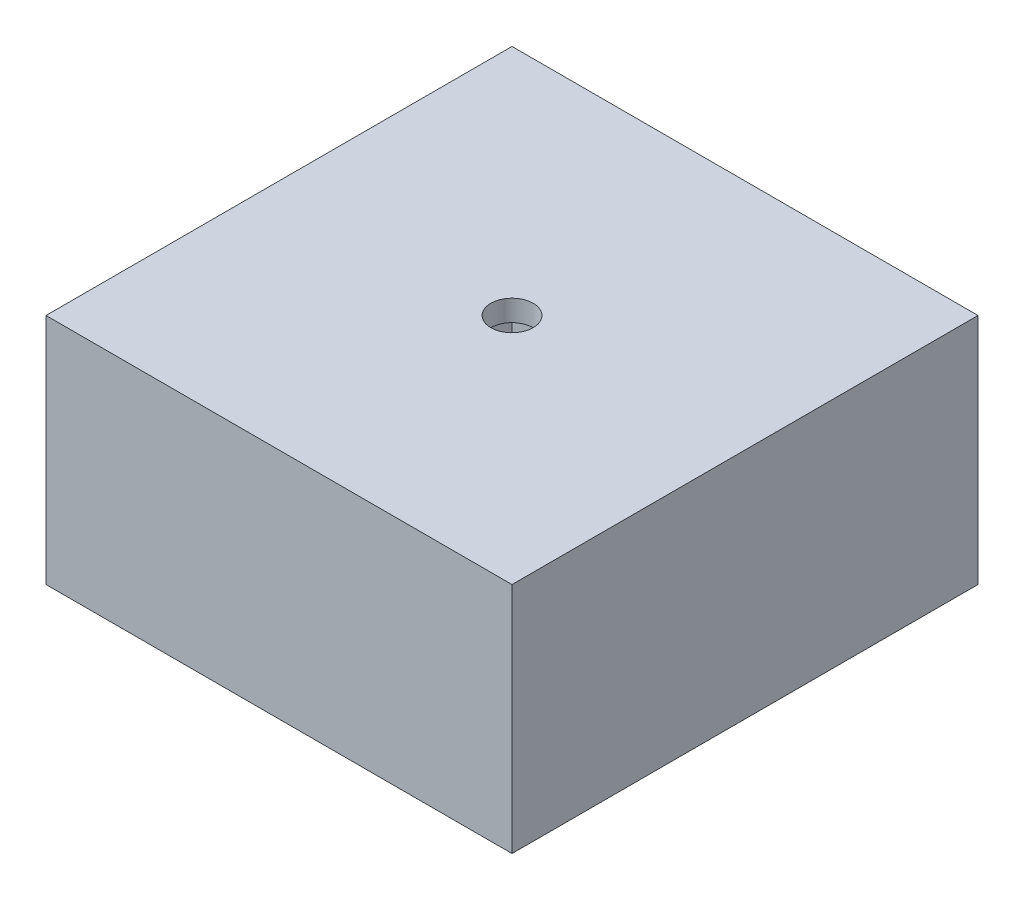
ISO-10303-21;
HEADER;
FILE_DESCRIPTION(('STEP AP214'),'2;1');
FILE_NAME('part.step','',(''),(''),'','','');
FILE_SCHEMA(('AUTOMOTIVE_DESIGN { 1 0 10303 214 1 1 1 1 }'));
ENDSEC;
DATA;
#1=APPLICATION_CONTEXT('core data for automotive mechanical design processes');
#2=APPLICATION_PROTOCOL_DEFINITION('international standard','automotive_design',2000,#1);
#3=PRODUCT_CONTEXT('',#1,'mechanical');
#4=PRODUCT('Part','Part','',(#3));
#5=PRODUCT_RELATED_PRODUCT_CATEGORY('part','',(#4));
#6=PRODUCT_DEFINITION_FORMATION('','',#4);
#7=PRODUCT_DEFINITION_CONTEXT('part definition',#1,'design');
#8=PRODUCT_DEFINITION('design','',#6,#7);
#9=PRODUCT_DEFINITION_SHAPE('','',#8);
#10=(LENGTH_UNIT() NAMED_UNIT(*) SI_UNIT(.MILLI.,.METRE.));
#11=(NAMED_UNIT(*) PLANE_ANGLE_UNIT() SI_UNIT($,.RADIAN.));
#12=(NAMED_UNIT(*) SI_UNIT($,.STERADIAN.) SOLID_ANGLE_UNIT());
#13=UNCERTAINTY_MEASURE_WITH_UNIT(LENGTH_MEASURE(1.E-05),#10,'distance_accuracy_value','');
#14=(GEOMETRIC_REPRESENTATION_CONTEXT(3) GLOBAL_UNCERTAINTY_ASSIGNED_CONTEXT((#13)) GLOBAL_UNIT_ASSIGNED_CONTEXT((#10,
#11,#12)) REPRESENTATION_CONTEXT('',''));
#15=CARTESIAN_POINT('',(0.,0.,0.));
#16=DIRECTION('',(0.,0.,1.));
#17=DIRECTION('',(1.,0.,0.));
#18=AXIS2_PLACEMENT_3D('',#15,#16,#17);
#19=CARTESIAN_POINT('',(0.,0.,0.));
#20=DIRECTION('',(0.,1.,0.));
#21=DIRECTION('',(0.,0.,1.));
#22=AXIS2_PLACEMENT_3D('',#19,#20,#21);
#23=PLANE('',#22);
#24=DIRECTION('',(0.,0.,-1.));
#25=VECTOR('',#24,1.);
#26=CARTESIAN_POINT('',(22.,0.,0.));
#27=LINE('',#26,#25);
#28=CARTESIAN_POINT('',(22.,0.,22.));
#29=VERTEX_POINT('',#28);
#30=CARTESIAN_POINT('',(22.,0.,-22.));
#31=VERTEX_POINT('',#30);
#32=EDGE_CURVE('E188',#29,#31,#27,.T.);
#33=ORIENTED_EDGE('',*,*,#32,.F.);
#34=DIRECTION('',(1.,0.,0.));
#35=VECTOR('',#34,1.);
#36=CARTESIAN_POINT('',(0.,0.,22.));
#37=LINE('',#36,#35);
#38=CARTESIAN_POINT('',(-22.,0.,22.));
#39=VERTEX_POINT('',#38);
#40=EDGE_CURVE('E194',#39,#29,#37,.T.);
#41=ORIENTED_EDGE('',*,*,#40,.F.);
#42=DIRECTION('',(0.,0.,1.));
#43=VECTOR('',#42,1.);
#44=CARTESIAN_POINT('',(-22.,0.,0.));
#45=LINE('',#44,#43);
#46=CARTESIAN_POINT('',(-22.,0.,-22.));
#47=VERTEX_POINT('',#46);
#48=EDGE_CURVE('E133',#47,#39,#45,.T.);
#49=ORIENTED_EDGE('',*,*,#48,.F.);
#50=DIRECTION('',(-1.,0.,0.));
#51=VECTOR('',#50,1.);
#52=CARTESIAN_POINT('',(0.,0.,-22.));
#53=LINE('',#52,#51);
#54=EDGE_CURVE('E191',#31,#47,#53,.T.);
#55=ORIENTED_EDGE('',*,*,#54,.F.);
#56=EDGE_LOOP('',(#33,#41,#49,#55));
#57=FACE_BOUND('',#56,.T.);
#58=DIRECTION('',(0.,0.,-1.));
#59=VECTOR('',#58,1.);
#60=CARTESIAN_POINT('',(20.,0.,20.));
#61=LINE('',#60,#59);
#62=CARTESIAN_POINT('',(20.,0.,20.));
#63=VERTEX_POINT('',#62);
#64=CARTESIAN_POINT('',(20.,0.,-20.));
#65=VERTEX_POINT('',#64);
#66=EDGE_CURVE('E82',#63,#65,#61,.T.);
#67=ORIENTED_EDGE('',*,*,#66,.T.);
#68=DIRECTION('',(-1.,0.,0.));
#69=VECTOR('',#68,1.);
#70=CARTESIAN_POINT('',(-20.,0.,-20.));
#71=LINE('',#70,#69);
#72=CARTESIAN_POINT('',(-20.,0.,-20.));
#73=VERTEX_POINT('',#72);
#74=EDGE_CURVE('E173',#65,#73,#71,.T.);
#75=ORIENTED_EDGE('',*,*,#74,.T.);
#76=DIRECTION('',(0.,0.,1.));
#77=VECTOR('',#76,1.);
#78=CARTESIAN_POINT('',(-20.,0.,20.));
#79=LINE('',#78,#77);
#80=CARTESIAN_POINT('',(-20.,0.,20.));
#81=VERTEX_POINT('',#80);
#82=EDGE_CURVE('E176',#73,#81,#79,.T.);
#83=ORIENTED_EDGE('',*,*,#82,.T.);
#84=DIRECTION('',(1.,0.,0.));
#85=VECTOR('',#84,1.);
#86=CARTESIAN_POINT('',(-20.,0.,20.));
#87=LINE('',#86,#85);
#88=EDGE_CURVE('E164',#81,#63,#87,.T.);
#89=ORIENTED_EDGE('',*,*,#88,.T.);
#90=EDGE_LOOP('',(#67,#75,#83,#89));
#91=FACE_BOUND('',#90,.T.);
#92=ADVANCED_FACE('F59',(#57,#91),#23,.F.);
#93=CARTESIAN_POINT('',(22.,20.,0.));
#94=DIRECTION('',(-1.,0.,0.));
#95=DIRECTION('',(0.,0.,1.));
#96=AXIS2_PLACEMENT_3D('',#93,#94,#95);
#97=PLANE('',#96);
#98=ORIENTED_EDGE('',*,*,#32,.T.);
#99=DIRECTION('',(0.,-1.,0.));
#100=VECTOR('',#99,1.);
#101=CARTESIAN_POINT('',(22.,20.,-22.));
#102=LINE('',#101,#100);
#103=CARTESIAN_POINT('',(22.,22.,-22.));
#104=VERTEX_POINT('',#103);
#105=EDGE_CURVE('E12',#104,#31,#102,.T.);
#106=ORIENTED_EDGE('',*,*,#105,.F.);
#107=DIRECTION('',(0.,0.,-1.));
#108=VECTOR('',#107,1.);
#109=CARTESIAN_POINT('',(22.,22.,-22.));
#110=LINE('',#109,#108);
#111=CARTESIAN_POINT('',(22.,22.,22.));
#112=VERTEX_POINT('',#111);
#113=EDGE_CURVE('E145',#112,#104,#110,.T.);
#114=ORIENTED_EDGE('',*,*,#113,.F.);
#115=DIRECTION('',(0.,-1.,0.));
#116=VECTOR('',#115,1.);
#117=CARTESIAN_POINT('',(22.,20.,22.));
#118=LINE('',#117,#116);
#119=EDGE_CURVE('E136',#112,#29,#118,.T.);
#120=ORIENTED_EDGE('',*,*,#119,.T.);
#121=EDGE_LOOP('',(#98,#106,#114,#120));
#122=FACE_BOUND('',#121,.T.);
#123=ADVANCED_FACE('F61',(#122),#97,.F.);
#124=CARTESIAN_POINT('',(0.,20.,-22.));
#125=DIRECTION('',(0.,0.,1.));
#126=DIRECTION('',(1.,0.,0.));
#127=AXIS2_PLACEMENT_3D('',#124,#125,#126);
#128=PLANE('',#127);
#129=ORIENTED_EDGE('',*,*,#54,.T.);
#130=DIRECTION('',(0.,-1.,0.));
#131=VECTOR('',#130,1.);
#132=CARTESIAN_POINT('',(-22.,20.,-22.));
#133=LINE('',#132,#131);
#134=CARTESIAN_POINT('',(-22.,22.,-22.));
#135=VERTEX_POINT('',#134);
#136=EDGE_CURVE('E67',#135,#47,#133,.T.);
#137=ORIENTED_EDGE('',*,*,#136,.F.);
#138=DIRECTION('',(-1.,0.,0.));
#139=VECTOR('',#138,1.);
#140=CARTESIAN_POINT('',(-22.,22.,-22.));
#141=LINE('',#140,#139);
#142=EDGE_CURVE('E150',#104,#135,#141,.T.);
#143=ORIENTED_EDGE('',*,*,#142,.F.);
#144=ORIENTED_EDGE('',*,*,#105,.T.);
#145=EDGE_LOOP('',(#129,#137,#143,#144));
#146=FACE_BOUND('',#145,.T.);
#147=ADVANCED_FACE('F201',(#146),#128,.F.);
#148=CARTESIAN_POINT('',(-22.,20.,0.));
#149=DIRECTION('',(1.,0.,0.));
#150=DIRECTION('',(0.,0.,-1.));
#151=AXIS2_PLACEMENT_3D('',#148,#149,#150);
#152=PLANE('',#151);
#153=ORIENTED_EDGE('',*,*,#48,.T.);
#154=DIRECTION('',(0.,-1.,0.));
#155=VECTOR('',#154,1.);
#156=CARTESIAN_POINT('',(-22.,20.,22.));
#157=LINE('',#156,#155);
#158=CARTESIAN_POINT('',(-22.,22.,22.));
#159=VERTEX_POINT('',#158);
#160=EDGE_CURVE('E126',#159,#39,#157,.T.);
#161=ORIENTED_EDGE('',*,*,#160,.F.);
#162=DIRECTION('',(0.,0.,1.));
#163=VECTOR('',#162,1.);
#164=CARTESIAN_POINT('',(-22.,22.,-22.));
#165=LINE('',#164,#163);
#166=EDGE_CURVE('E131',#135,#159,#165,.T.);
#167=ORIENTED_EDGE('',*,*,#166,.F.);
#168=ORIENTED_EDGE('',*,*,#136,.T.);
#169=EDGE_LOOP('',(#153,#161,#167,#168));
#170=FACE_BOUND('',#169,.T.);
#171=ADVANCED_FACE('F128',(#170),#152,.F.);
#172=CARTESIAN_POINT('',(0.,20.,22.));
#173=DIRECTION('',(0.,0.,-1.));
#174=DIRECTION('',(-1.,0.,0.));
#175=AXIS2_PLACEMENT_3D('',#172,#173,#174);
#176=PLANE('',#175);
#177=ORIENTED_EDGE('',*,*,#40,.T.);
#178=ORIENTED_EDGE('',*,*,#119,.F.);
#179=DIRECTION('',(1.,0.,0.));
#180=VECTOR('',#179,1.);
#181=CARTESIAN_POINT('',(-22.,22.,22.));
#182=LINE('',#181,#180);
#183=EDGE_CURVE('E139',#159,#112,#182,.T.);
#184=ORIENTED_EDGE('',*,*,#183,.F.);
#185=ORIENTED_EDGE('',*,*,#160,.T.);
#186=EDGE_LOOP('',(#177,#178,#184,#185));
#187=FACE_BOUND('',#186,.T.);
#188=ADVANCED_FACE('F140',(#187),#176,.F.);
#189=CARTESIAN_POINT('',(20.,20.,20.));
#190=DIRECTION('',(-1.,0.,0.));
#191=DIRECTION('',(0.,0.,1.));
#192=AXIS2_PLACEMENT_3D('',#189,#190,#191);
#193=PLANE('',#192);
#194=ORIENTED_EDGE('',*,*,#66,.F.);
#195=DIRECTION('',(0.,-1.,0.));
#196=VECTOR('',#195,1.);
#197=CARTESIAN_POINT('',(20.,20.,20.));
#198=LINE('',#197,#196);
#199=CARTESIAN_POINT('',(20.,20.,20.));
#200=VERTEX_POINT('',#199);
#201=EDGE_CURVE('E171',#200,#63,#198,.T.);
#202=ORIENTED_EDGE('',*,*,#201,.F.);
#203=DIRECTION('',(0.,0.,-1.));
#204=VECTOR('',#203,1.);
#205=CARTESIAN_POINT('',(20.,20.,20.));
#206=LINE('',#205,#204);
#207=CARTESIAN_POINT('',(20.,20.,-20.));
#208=VERTEX_POINT('',#207);
#209=EDGE_CURVE('E160',#200,#208,#206,.T.);
#210=ORIENTED_EDGE('',*,*,#209,.T.);
#211=DIRECTION('',(0.,-1.,0.));
#212=VECTOR('',#211,1.);
#213=CARTESIAN_POINT('',(20.,20.,-20.));
#214=LINE('',#213,#212);
#215=EDGE_CURVE('E186',#208,#65,#214,.T.);
#216=ORIENTED_EDGE('',*,*,#215,.T.);
#217=EDGE_LOOP('',(#194,#202,#210,#216));
#218=FACE_BOUND('',#217,.T.);
#219=ADVANCED_FACE('F214',(#218),#193,.T.);
#220=CARTESIAN_POINT('',(-20.,20.,-20.));
#221=DIRECTION('',(0.,0.,1.));
#222=DIRECTION('',(1.,0.,0.));
#223=AXIS2_PLACEMENT_3D('',#220,#221,#222);
#224=PLANE('',#223);
#225=ORIENTED_EDGE('',*,*,#74,.F.);
#226=ORIENTED_EDGE('',*,*,#215,.F.);
#227=DIRECTION('',(-1.,0.,0.));
#228=VECTOR('',#227,1.);
#229=CARTESIAN_POINT('',(-20.,20.,-20.));
#230=LINE('',#229,#228);
#231=CARTESIAN_POINT('',(-20.,20.,-20.));
#232=VERTEX_POINT('',#231);
#233=EDGE_CURVE('E163',#208,#232,#230,.T.);
#234=ORIENTED_EDGE('',*,*,#233,.T.);
#235=DIRECTION('',(0.,-1.,0.));
#236=VECTOR('',#235,1.);
#237=CARTESIAN_POINT('',(-20.,20.,-20.));
#238=LINE('',#237,#236);
#239=EDGE_CURVE('E184',#232,#73,#238,.T.);
#240=ORIENTED_EDGE('',*,*,#239,.T.);
#241=EDGE_LOOP('',(#225,#226,#234,#240));
#242=FACE_BOUND('',#241,.T.);
#243=ADVANCED_FACE('F220',(#242),#224,.T.);
#244=CARTESIAN_POINT('',(-20.,20.,20.));
#245=DIRECTION('',(1.,0.,0.));
#246=DIRECTION('',(0.,0.,-1.));
#247=AXIS2_PLACEMENT_3D('',#244,#245,#246);
#248=PLANE('',#247);
#249=ORIENTED_EDGE('',*,*,#82,.F.);
#250=ORIENTED_EDGE('',*,*,#239,.F.);
#251=DIRECTION('',(0.,0.,1.));
#252=VECTOR('',#251,1.);
#253=CARTESIAN_POINT('',(-20.,20.,20.));
#254=LINE('',#253,#252);
#255=CARTESIAN_POINT('',(-20.,20.,20.));
#256=VERTEX_POINT('',#255);
#257=EDGE_CURVE('E167',#232,#256,#254,.T.);
#258=ORIENTED_EDGE('',*,*,#257,.T.);
#259=DIRECTION('',(0.,-1.,0.));
#260=VECTOR('',#259,1.);
#261=CARTESIAN_POINT('',(-20.,20.,20.));
#262=LINE('',#261,#260);
#263=EDGE_CURVE('E182',#256,#81,#262,.T.);
#264=ORIENTED_EDGE('',*,*,#263,.T.);
#265=EDGE_LOOP('',(#249,#250,#258,#264));
#266=FACE_BOUND('',#265,.T.);
#267=ADVANCED_FACE('F224',(#266),#248,.T.);
#268=CARTESIAN_POINT('',(-20.,20.,20.));
#269=DIRECTION('',(0.,0.,-1.));
#270=DIRECTION('',(-1.,0.,0.));
#271=AXIS2_PLACEMENT_3D('',#268,#269,#270);
#272=PLANE('',#271);
#273=ORIENTED_EDGE('',*,*,#88,.F.);
#274=ORIENTED_EDGE('',*,*,#263,.F.);
#275=DIRECTION('',(1.,0.,0.));
#276=VECTOR('',#275,1.);
#277=CARTESIAN_POINT('',(-20.,20.,20.));
#278=LINE('',#277,#276);
#279=EDGE_CURVE('E74',#256,#200,#278,.T.);
#280=ORIENTED_EDGE('',*,*,#279,.T.);
#281=ORIENTED_EDGE('',*,*,#201,.T.);
#282=EDGE_LOOP('',(#273,#274,#280,#281));
#283=FACE_BOUND('',#282,.T.);
#284=ADVANCED_FACE('F229',(#283),#272,.T.);
#285=CARTESIAN_POINT('',(0.,20.,0.));
#286=DIRECTION('',(0.,1.,0.));
#287=DIRECTION('',(0.,0.,1.));
#288=AXIS2_PLACEMENT_3D('',#285,#286,#287);
#289=PLANE('',#288);
#290=CARTESIAN_POINT('',(0.,20.,0.));
#291=DIRECTION('',(0.,1.,0.));
#292=DIRECTION('',(0.,0.,1.));
#293=AXIS2_PLACEMENT_3D('',#290,#291,#292);
#294=CIRCLE('',#293,2.);
#295=CARTESIAN_POINT('',(0.,20.,2.));
#296=VERTEX_POINT('',#295);
#297=EDGE_CURVE('E151',#296,#296,#294,.T.);
#298=ORIENTED_EDGE('',*,*,#297,.T.);
#299=EDGE_LOOP('',(#298));
#300=FACE_BOUND('',#299,.T.);
#301=ORIENTED_EDGE('',*,*,#233,.F.);
#302=ORIENTED_EDGE('',*,*,#209,.F.);
#303=ORIENTED_EDGE('',*,*,#279,.F.);
#304=ORIENTED_EDGE('',*,*,#257,.F.);
#305=EDGE_LOOP('',(#301,#302,#303,#304));
#306=FACE_BOUND('',#305,.T.);
#307=ADVANCED_FACE('F235',(#300,#306),#289,.F.);
#308=CARTESIAN_POINT('',(0.,22.,0.));
#309=DIRECTION('',(0.,1.,0.));
#310=DIRECTION('',(0.,0.,1.));
#311=AXIS2_PLACEMENT_3D('',#308,#309,#310);
#312=PLANE('',#311);
#313=CARTESIAN_POINT('',(0.,22.,0.));
#314=DIRECTION('',(0.,1.,0.));
#315=DIRECTION('',(0.,0.,1.));
#316=AXIS2_PLACEMENT_3D('',#313,#314,#315);
#317=CIRCLE('',#316,2.);
#318=CARTESIAN_POINT('',(0.,22.,2.));
#319=VERTEX_POINT('',#318);
#320=EDGE_CURVE('E154',#319,#319,#317,.T.);
#321=ORIENTED_EDGE('',*,*,#320,.F.);
#322=EDGE_LOOP('',(#321));
#323=FACE_BOUND('',#322,.T.);
#324=ORIENTED_EDGE('',*,*,#166,.T.);
#325=ORIENTED_EDGE('',*,*,#183,.T.);
#326=ORIENTED_EDGE('',*,*,#113,.T.);
#327=ORIENTED_EDGE('',*,*,#142,.T.);
#328=EDGE_LOOP('',(#324,#325,#326,#327));
#329=FACE_BOUND('',#328,.T.);
#330=ADVANCED_FACE('F148',(#323,#329),#312,.T.);
#331=CARTESIAN_POINT('',(0.,20.,0.));
#332=DIRECTION('',(0.,1.,0.));
#333=DIRECTION('',(0.,0.,1.));
#334=AXIS2_PLACEMENT_3D('',#331,#332,#333);
#335=CYLINDRICAL_SURFACE('',#334,2.);
#336=ORIENTED_EDGE('',*,*,#297,.F.);
#337=EDGE_LOOP('',(#336));
#338=FACE_BOUND('',#337,.T.);
#339=ORIENTED_EDGE('',*,*,#320,.T.);
#340=EDGE_LOOP('',(#339));
#341=FACE_BOUND('',#340,.T.);
#342=ADVANCED_FACE('F242',(#338,#341),#335,.F.);
#343=CLOSED_SHELL('',(#92,#123,#147,#171,#188,#219,#243,#267,#284,#307,#330,#342));
#344=MANIFOLD_SOLID_BREP('B2',#343);
#345=ADVANCED_BREP_SHAPE_REPRESENTATION('',(#18,#344),#14);
#346=SHAPE_DEFINITION_REPRESENTATION(#9,#345);
ENDSEC;
END-ISO-10303-21;
